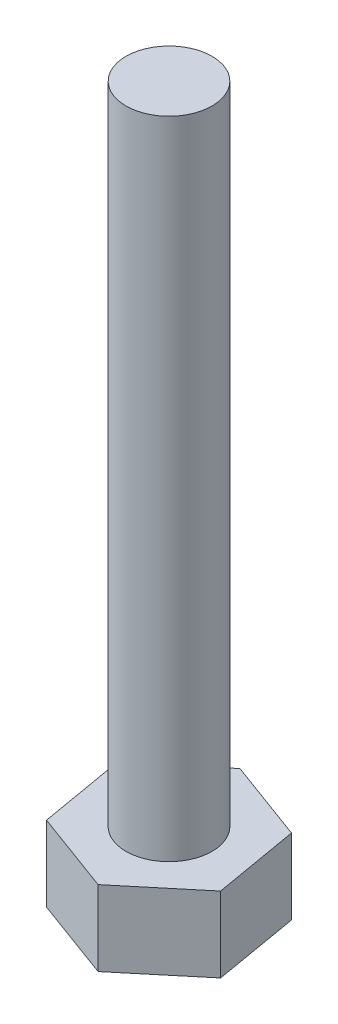
ISO-10303-21;
HEADER;
FILE_DESCRIPTION(('STEP AP214'),'2;1');
FILE_NAME('part.step','',(''),(''),'','','');
FILE_SCHEMA(('AUTOMOTIVE_DESIGN { 1 0 10303 214 1 1 1 1 }'));
ENDSEC;
DATA;
#1=APPLICATION_CONTEXT('core data for automotive mechanical design processes');
#2=APPLICATION_PROTOCOL_DEFINITION('international standard','automotive_design',2000,#1);
#3=PRODUCT_CONTEXT('',#1,'mechanical');
#4=PRODUCT('Part','Part','',(#3));
#5=PRODUCT_RELATED_PRODUCT_CATEGORY('part','',(#4));
#6=PRODUCT_DEFINITION_FORMATION('','',#4);
#7=PRODUCT_DEFINITION_CONTEXT('part definition',#1,'design');
#8=PRODUCT_DEFINITION('design','',#6,#7);
#9=PRODUCT_DEFINITION_SHAPE('','',#8);
#10=(LENGTH_UNIT() NAMED_UNIT(*) SI_UNIT(.MILLI.,.METRE.));
#11=(NAMED_UNIT(*) PLANE_ANGLE_UNIT() SI_UNIT($,.RADIAN.));
#12=(NAMED_UNIT(*) SI_UNIT($,.STERADIAN.) SOLID_ANGLE_UNIT());
#13=UNCERTAINTY_MEASURE_WITH_UNIT(LENGTH_MEASURE(1.E-05),#10,'distance_accuracy_value','');
#14=(GEOMETRIC_REPRESENTATION_CONTEXT(3) GLOBAL_UNCERTAINTY_ASSIGNED_CONTEXT((#13)) GLOBAL_UNIT_ASSIGNED_CONTEXT((#10,
#11,#12)) REPRESENTATION_CONTEXT('',''));
#15=CARTESIAN_POINT('',(0.,0.,0.));
#16=DIRECTION('',(0.,0.,1.));
#17=DIRECTION('',(1.,0.,0.));
#18=AXIS2_PLACEMENT_3D('',#15,#16,#17);
#19=CARTESIAN_POINT('',(3.79293918233498,3.5,1.39532995826844));
#20=DIRECTION('',(0.,1.,0.));
#21=DIRECTION('',(0.,0.,1.));
#22=AXIS2_PLACEMENT_3D('',#19,#20,#21);
#23=PLANE('',#22);
#24=DIRECTION('',(0.768253803473447,0.,-0.640145368997217));
#25=VECTOR('',#24,1.);
#26=CARTESIAN_POINT('',(0.688078400645538,3.5,3.98244666604569));
#27=LINE('',#26,#25);
#28=CARTESIAN_POINT('',(0.688078400645538,3.5,3.98244666604569));
#29=VERTEX_POINT('',#28);
#30=CARTESIAN_POINT('',(3.79293918233498,3.5,1.39532995826844));
#31=VERTEX_POINT('',#30);
#32=EDGE_CURVE('E126',#29,#31,#27,.T.);
#33=ORIENTED_EDGE('',*,*,#32,.T.);
#34=DIRECTION('',(-0.17025524992983,0.,-0.985399994860631));
#35=VECTOR('',#34,1.);
#36=CARTESIAN_POINT('',(3.79293918233498,3.5,1.39532995826844));
#37=LINE('',#36,#35);
#38=CARTESIAN_POINT('',(3.10486078168944,3.5,-2.58711670777725));
#39=VERTEX_POINT('',#38);
#40=EDGE_CURVE('E84',#31,#39,#37,.T.);
#41=ORIENTED_EDGE('',*,*,#40,.T.);
#42=DIRECTION('',(-0.938509053403277,0.,-0.345254625863414));
#43=VECTOR('',#42,1.);
#44=CARTESIAN_POINT('',(3.10486078168944,3.5,-2.58711670777725));
#45=LINE('',#44,#43);
#46=CARTESIAN_POINT('',(-0.688078400645539,3.5,-3.98244666604569));
#47=VERTEX_POINT('',#46);
#48=EDGE_CURVE('E97',#39,#47,#45,.T.);
#49=ORIENTED_EDGE('',*,*,#48,.T.);
#50=DIRECTION('',(-0.768253803473447,0.,0.640145368997217));
#51=VECTOR('',#50,1.);
#52=CARTESIAN_POINT('',(-0.688078400645539,3.5,-3.98244666604569));
#53=LINE('',#52,#51);
#54=CARTESIAN_POINT('',(-3.79293918233498,3.5,-1.39532995826844));
#55=VERTEX_POINT('',#54);
#56=EDGE_CURVE('E91',#47,#55,#53,.T.);
#57=ORIENTED_EDGE('',*,*,#56,.T.);
#58=DIRECTION('',(0.17025524992983,0.,0.985399994860631));
#59=VECTOR('',#58,1.);
#60=CARTESIAN_POINT('',(-3.79293918233498,3.5,-1.39532995826844));
#61=LINE('',#60,#59);
#62=CARTESIAN_POINT('',(-3.10486078168944,3.5,2.58711670777725));
#63=VERTEX_POINT('',#62);
#64=EDGE_CURVE('E95',#55,#63,#61,.T.);
#65=ORIENTED_EDGE('',*,*,#64,.T.);
#66=DIRECTION('',(0.938509053403276,0.,0.345254625863415));
#67=VECTOR('',#66,1.);
#68=CARTESIAN_POINT('',(-3.10486078168944,3.5,2.58711670777725));
#69=LINE('',#68,#67);
#70=EDGE_CURVE('E47',#63,#29,#69,.T.);
#71=ORIENTED_EDGE('',*,*,#70,.T.);
#72=EDGE_LOOP('',(#33,#41,#49,#57,#65,#71));
#73=FACE_BOUND('',#72,.T.);
#74=CARTESIAN_POINT('',(0.,3.5,0.));
#75=DIRECTION('',(0.,1.,0.));
#76=DIRECTION('',(0.,0.,1.));
#77=AXIS2_PLACEMENT_3D('',#74,#75,#76);
#78=CIRCLE('',#77,2.);
#79=CARTESIAN_POINT('',(0.,3.5,2.));
#80=VERTEX_POINT('',#79);
#81=EDGE_CURVE('E166',#80,#80,#78,.T.);
#82=ORIENTED_EDGE('',*,*,#81,.F.);
#83=EDGE_LOOP('',(#82));
#84=FACE_BOUND('',#83,.T.);
#85=ADVANCED_FACE('F30',(#73,#84),#23,.T.);
#86=CARTESIAN_POINT('',(0.688078400645538,3.5,3.98244666604569));
#87=DIRECTION('',(-0.640145368997217,0.,-0.768253803473447));
#88=DIRECTION('',(-0.768253803473447,0.,0.640145368997217));
#89=AXIS2_PLACEMENT_3D('',#86,#87,#88);
#90=PLANE('',#89);
#91=DIRECTION('',(0.768253803473447,0.,-0.640145368997217));
#92=VECTOR('',#91,1.);
#93=CARTESIAN_POINT('',(0.688078400645538,0.,3.98244666604569));
#94=LINE('',#93,#92);
#95=CARTESIAN_POINT('',(0.688078400645538,0.,3.98244666604569));
#96=VERTEX_POINT('',#95);
#97=CARTESIAN_POINT('',(3.79293918233498,0.,1.39532995826844));
#98=VERTEX_POINT('',#97);
#99=EDGE_CURVE('E115',#96,#98,#94,.T.);
#100=ORIENTED_EDGE('',*,*,#99,.T.);
#101=DIRECTION('',(0.,-1.,0.));
#102=VECTOR('',#101,1.);
#103=CARTESIAN_POINT('',(3.79293918233498,3.5,1.39532995826844));
#104=LINE('',#103,#102);
#105=EDGE_CURVE('E11',#31,#98,#104,.T.);
#106=ORIENTED_EDGE('',*,*,#105,.F.);
#107=ORIENTED_EDGE('',*,*,#32,.F.);
#108=DIRECTION('',(0.,-1.,0.));
#109=VECTOR('',#108,1.);
#110=CARTESIAN_POINT('',(0.688078400645538,3.5,3.98244666604569));
#111=LINE('',#110,#109);
#112=EDGE_CURVE('E111',#29,#96,#111,.T.);
#113=ORIENTED_EDGE('',*,*,#112,.T.);
#114=EDGE_LOOP('',(#100,#106,#107,#113));
#115=FACE_BOUND('',#114,.T.);
#116=ADVANCED_FACE('F32',(#115),#90,.F.);
#117=CARTESIAN_POINT('',(3.79293918233498,3.5,1.39532995826844));
#118=DIRECTION('',(-0.985399994860631,0.,0.17025524992983));
#119=DIRECTION('',(0.17025524992983,0.,0.985399994860631));
#120=AXIS2_PLACEMENT_3D('',#117,#118,#119);
#121=PLANE('',#120);
#122=DIRECTION('',(-0.17025524992983,0.,-0.985399994860631));
#123=VECTOR('',#122,1.);
#124=CARTESIAN_POINT('',(3.79293918233498,0.,1.39532995826844));
#125=LINE('',#124,#123);
#126=CARTESIAN_POINT('',(3.10486078168944,0.,-2.58711670777725));
#127=VERTEX_POINT('',#126);
#128=EDGE_CURVE('E118',#98,#127,#125,.T.);
#129=ORIENTED_EDGE('',*,*,#128,.T.);
#130=DIRECTION('',(0.,-1.,0.));
#131=VECTOR('',#130,1.);
#132=CARTESIAN_POINT('',(3.10486078168944,3.5,-2.58711670777725));
#133=LINE('',#132,#131);
#134=EDGE_CURVE('E39',#39,#127,#133,.T.);
#135=ORIENTED_EDGE('',*,*,#134,.F.);
#136=ORIENTED_EDGE('',*,*,#40,.F.);
#137=ORIENTED_EDGE('',*,*,#105,.T.);
#138=EDGE_LOOP('',(#129,#135,#136,#137));
#139=FACE_BOUND('',#138,.T.);
#140=ADVANCED_FACE('F154',(#139),#121,.F.);
#141=CARTESIAN_POINT('',(3.10486078168944,3.5,-2.58711670777725));
#142=DIRECTION('',(-0.345254625863414,0.,0.938509053403276));
#143=DIRECTION('',(0.938509053403276,0.,0.345254625863414));
#144=AXIS2_PLACEMENT_3D('',#141,#142,#143);
#145=PLANE('',#144);
#146=DIRECTION('',(-0.938509053403277,0.,-0.345254625863414));
#147=VECTOR('',#146,1.);
#148=CARTESIAN_POINT('',(3.10486078168944,0.,-2.58711670777725));
#149=LINE('',#148,#147);
#150=CARTESIAN_POINT('',(-0.688078400645539,0.,-3.98244666604569));
#151=VERTEX_POINT('',#150);
#152=EDGE_CURVE('E121',#127,#151,#149,.T.);
#153=ORIENTED_EDGE('',*,*,#152,.T.);
#154=DIRECTION('',(0.,-1.,0.));
#155=VECTOR('',#154,1.);
#156=CARTESIAN_POINT('',(-0.688078400645539,3.5,-3.98244666604569));
#157=LINE('',#156,#155);
#158=EDGE_CURVE('E106',#47,#151,#157,.T.);
#159=ORIENTED_EDGE('',*,*,#158,.F.);
#160=ORIENTED_EDGE('',*,*,#48,.F.);
#161=ORIENTED_EDGE('',*,*,#134,.T.);
#162=EDGE_LOOP('',(#153,#159,#160,#161));
#163=FACE_BOUND('',#162,.T.);
#164=ADVANCED_FACE('F132',(#163),#145,.F.);
#165=CARTESIAN_POINT('',(-0.688078400645539,3.5,-3.98244666604569));
#166=DIRECTION('',(0.640145368997217,0.,0.768253803473447));
#167=DIRECTION('',(0.768253803473447,0.,-0.640145368997217));
#168=AXIS2_PLACEMENT_3D('',#165,#166,#167);
#169=PLANE('',#168);
#170=DIRECTION('',(-0.768253803473447,0.,0.640145368997217));
#171=VECTOR('',#170,1.);
#172=CARTESIAN_POINT('',(-0.688078400645539,0.,-3.98244666604569));
#173=LINE('',#172,#171);
#174=CARTESIAN_POINT('',(-3.79293918233498,0.,-1.39532995826844));
#175=VERTEX_POINT('',#174);
#176=EDGE_CURVE('E105',#151,#175,#173,.T.);
#177=ORIENTED_EDGE('',*,*,#176,.T.);
#178=DIRECTION('',(0.,-1.,0.));
#179=VECTOR('',#178,1.);
#180=CARTESIAN_POINT('',(-3.79293918233498,3.5,-1.39532995826844));
#181=LINE('',#180,#179);
#182=EDGE_CURVE('E102',#55,#175,#181,.T.);
#183=ORIENTED_EDGE('',*,*,#182,.F.);
#184=ORIENTED_EDGE('',*,*,#56,.F.);
#185=ORIENTED_EDGE('',*,*,#158,.T.);
#186=EDGE_LOOP('',(#177,#183,#184,#185));
#187=FACE_BOUND('',#186,.T.);
#188=ADVANCED_FACE('F103',(#187),#169,.F.);
#189=CARTESIAN_POINT('',(-3.79293918233498,3.5,-1.39532995826844));
#190=DIRECTION('',(0.985399994860631,0.,-0.17025524992983));
#191=DIRECTION('',(-0.17025524992983,0.,-0.985399994860631));
#192=AXIS2_PLACEMENT_3D('',#189,#190,#191);
#193=PLANE('',#192);
#194=DIRECTION('',(0.17025524992983,0.,0.985399994860631));
#195=VECTOR('',#194,1.);
#196=CARTESIAN_POINT('',(-3.79293918233498,0.,-1.39532995826844));
#197=LINE('',#196,#195);
#198=CARTESIAN_POINT('',(-3.10486078168944,0.,2.58711670777725));
#199=VERTEX_POINT('',#198);
#200=EDGE_CURVE('E70',#175,#199,#197,.T.);
#201=ORIENTED_EDGE('',*,*,#200,.T.);
#202=DIRECTION('',(0.,-1.,0.));
#203=VECTOR('',#202,1.);
#204=CARTESIAN_POINT('',(-3.10486078168944,3.5,2.58711670777725));
#205=LINE('',#204,#203);
#206=EDGE_CURVE('E107',#63,#199,#205,.T.);
#207=ORIENTED_EDGE('',*,*,#206,.F.);
#208=ORIENTED_EDGE('',*,*,#64,.F.);
#209=ORIENTED_EDGE('',*,*,#182,.T.);
#210=EDGE_LOOP('',(#201,#207,#208,#209));
#211=FACE_BOUND('',#210,.T.);
#212=ADVANCED_FACE('F109',(#211),#193,.F.);
#213=CARTESIAN_POINT('',(-3.10486078168944,3.5,2.58711670777725));
#214=DIRECTION('',(0.345254625863414,0.,-0.938509053403276));
#215=DIRECTION('',(-0.938509053403276,0.,-0.345254625863414));
#216=AXIS2_PLACEMENT_3D('',#213,#214,#215);
#217=PLANE('',#216);
#218=DIRECTION('',(0.938509053403276,0.,0.345254625863415));
#219=VECTOR('',#218,1.);
#220=CARTESIAN_POINT('',(-3.10486078168944,0.,2.58711670777725));
#221=LINE('',#220,#219);
#222=EDGE_CURVE('E76',#199,#96,#221,.T.);
#223=ORIENTED_EDGE('',*,*,#222,.T.);
#224=ORIENTED_EDGE('',*,*,#112,.F.);
#225=ORIENTED_EDGE('',*,*,#70,.F.);
#226=ORIENTED_EDGE('',*,*,#206,.T.);
#227=EDGE_LOOP('',(#223,#224,#225,#226));
#228=FACE_BOUND('',#227,.T.);
#229=ADVANCED_FACE('F139',(#228),#217,.F.);
#230=CARTESIAN_POINT('',(3.79293918233498,0.,1.39532995826844));
#231=DIRECTION('',(0.,1.,0.));
#232=DIRECTION('',(0.,0.,1.));
#233=AXIS2_PLACEMENT_3D('',#230,#231,#232);
#234=PLANE('',#233);
#235=ORIENTED_EDGE('',*,*,#99,.F.);
#236=ORIENTED_EDGE('',*,*,#222,.F.);
#237=ORIENTED_EDGE('',*,*,#200,.F.);
#238=ORIENTED_EDGE('',*,*,#176,.F.);
#239=ORIENTED_EDGE('',*,*,#152,.F.);
#240=ORIENTED_EDGE('',*,*,#128,.F.);
#241=EDGE_LOOP('',(#235,#236,#237,#238,#239,#240));
#242=FACE_BOUND('',#241,.T.);
#243=ADVANCED_FACE('F135',(#242),#234,.F.);
#244=CARTESIAN_POINT('',(0.,33.5,0.));
#245=DIRECTION('',(0.,-1.,0.));
#246=DIRECTION('',(0.,0.,-1.));
#247=AXIS2_PLACEMENT_3D('',#244,#245,#246);
#248=CYLINDRICAL_SURFACE('',#247,2.);
#249=CARTESIAN_POINT('',(0.,33.5,0.));
#250=DIRECTION('',(0.,1.,0.));
#251=DIRECTION('',(0.,0.,1.));
#252=AXIS2_PLACEMENT_3D('',#249,#250,#251);
#253=CIRCLE('',#252,2.);
#254=CARTESIAN_POINT('',(0.,33.5,2.));
#255=VERTEX_POINT('',#254);
#256=EDGE_CURVE('E119',#255,#255,#253,.T.);
#257=ORIENTED_EDGE('',*,*,#256,.F.);
#258=EDGE_LOOP('',(#257));
#259=FACE_BOUND('',#258,.T.);
#260=ORIENTED_EDGE('',*,*,#81,.T.);
#261=EDGE_LOOP('',(#260));
#262=FACE_BOUND('',#261,.T.);
#263=ADVANCED_FACE('F146',(#259,#262),#248,.T.);
#264=CARTESIAN_POINT('',(0.,33.5,0.));
#265=DIRECTION('',(0.,1.,0.));
#266=DIRECTION('',(0.,0.,1.));
#267=AXIS2_PLACEMENT_3D('',#264,#265,#266);
#268=PLANE('',#267);
#269=ORIENTED_EDGE('',*,*,#256,.T.);
#270=EDGE_LOOP('',(#269));
#271=FACE_BOUND('',#270,.T.);
#272=ADVANCED_FACE('F158',(#271),#268,.T.);
#273=CLOSED_SHELL('',(#85,#116,#140,#164,#188,#212,#229,#243,#263,#272));
#274=MANIFOLD_SOLID_BREP('B2',#273);
#275=ADVANCED_BREP_SHAPE_REPRESENTATION('',(#18,#274),#14);
#276=SHAPE_DEFINITION_REPRESENTATION(#9,#275);
ENDSEC;
END-ISO-10303-21;
